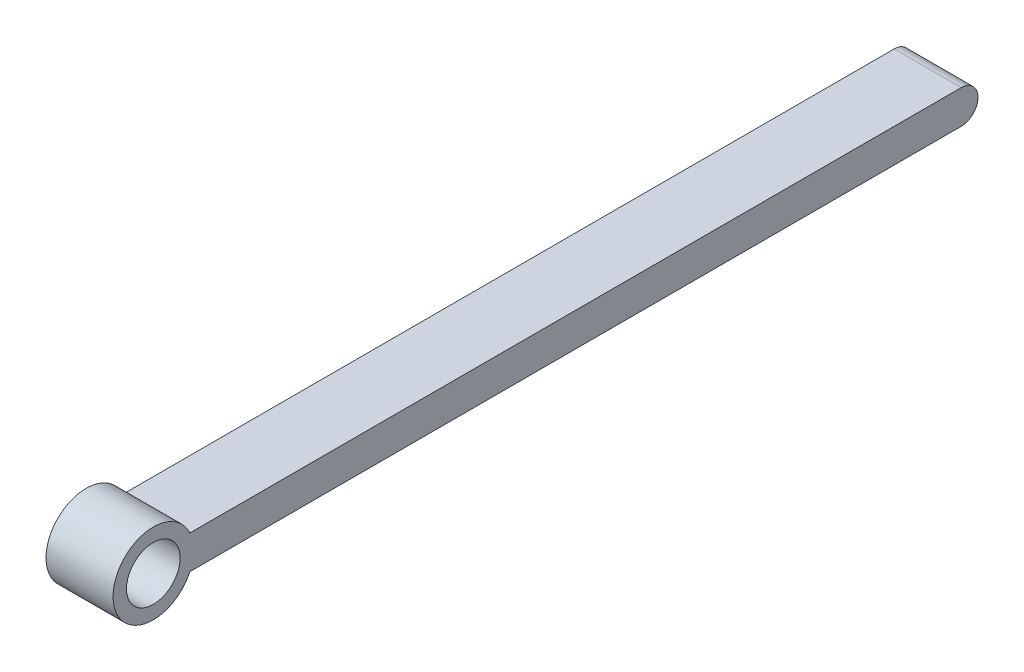
ISO-10303-21;
HEADER;
FILE_DESCRIPTION(('STEP AP214'),'2;1');
FILE_NAME('part.step','',(''),(''),'','','');
FILE_SCHEMA(('AUTOMOTIVE_DESIGN { 1 0 10303 214 1 1 1 1 }'));
ENDSEC;
DATA;
#1=APPLICATION_CONTEXT('core data for automotive mechanical design processes');
#2=APPLICATION_PROTOCOL_DEFINITION('international standard','automotive_design',2000,#1);
#3=PRODUCT_CONTEXT('',#1,'mechanical');
#4=PRODUCT('Part','Part','',(#3));
#5=PRODUCT_RELATED_PRODUCT_CATEGORY('part','',(#4));
#6=PRODUCT_DEFINITION_FORMATION('','',#4);
#7=PRODUCT_DEFINITION_CONTEXT('part definition',#1,'design');
#8=PRODUCT_DEFINITION('design','',#6,#7);
#9=PRODUCT_DEFINITION_SHAPE('','',#8);
#10=(LENGTH_UNIT() NAMED_UNIT(*) SI_UNIT(.MILLI.,.METRE.));
#11=(NAMED_UNIT(*) PLANE_ANGLE_UNIT() SI_UNIT($,.RADIAN.));
#12=(NAMED_UNIT(*) SI_UNIT($,.STERADIAN.) SOLID_ANGLE_UNIT());
#13=UNCERTAINTY_MEASURE_WITH_UNIT(LENGTH_MEASURE(1.E-05),#10,'distance_accuracy_value','');
#14=(GEOMETRIC_REPRESENTATION_CONTEXT(3) GLOBAL_UNCERTAINTY_ASSIGNED_CONTEXT((#13)) GLOBAL_UNIT_ASSIGNED_CONTEXT((#10,
#11,#12)) REPRESENTATION_CONTEXT('',''));
#15=CARTESIAN_POINT('',(0.,0.,0.));
#16=DIRECTION('',(0.,0.,1.));
#17=DIRECTION('',(1.,0.,0.));
#18=AXIS2_PLACEMENT_3D('',#15,#16,#17);
#19=CARTESIAN_POINT('',(10.,18.1245417068373,-19.5728478067927));
#20=DIRECTION('',(-1.,0.,0.));
#21=DIRECTION('',(0.,0.,1.));
#22=AXIS2_PLACEMENT_3D('',#19,#20,#21);
#23=CYLINDRICAL_SURFACE('',#22,5.99999999999999);
#24=CARTESIAN_POINT('',(0.,18.1245417068373,-19.5728478067927));
#25=DIRECTION('',(1.,0.,0.));
#26=DIRECTION('',(0.,0.,-1.));
#27=AXIS2_PLACEMENT_3D('',#24,#25,#26);
#28=CIRCLE('',#27,5.99999999999999);
#29=CARTESIAN_POINT('',(0.,20.6245417068374,-25.0272038641105));
#30=VERTEX_POINT('',#29);
#31=CARTESIAN_POINT('',(0.,15.6245417068374,-25.0272038641106));
#32=VERTEX_POINT('',#31);
#33=EDGE_CURVE('E100',#30,#32,#28,.T.);
#34=ORIENTED_EDGE('',*,*,#33,.T.);
#35=DIRECTION('',(-1.,0.,0.));
#36=VECTOR('',#35,1.);
#37=CARTESIAN_POINT('',(10.,15.6245417068374,-25.0272038641106));
#38=LINE('',#37,#36);
#39=CARTESIAN_POINT('',(10.,15.6245417068374,-25.0272038641106));
#40=VERTEX_POINT('',#39);
#41=EDGE_CURVE('E11',#40,#32,#38,.T.);
#42=ORIENTED_EDGE('',*,*,#41,.F.);
#43=CARTESIAN_POINT('',(10.,18.1245417068373,-19.5728478067927));
#44=DIRECTION('',(1.,0.,0.));
#45=DIRECTION('',(0.,0.,-1.));
#46=AXIS2_PLACEMENT_3D('',#43,#44,#45);
#47=CIRCLE('',#46,5.99999999999999);
#48=CARTESIAN_POINT('',(10.,20.6245417068374,-25.0272038641105));
#49=VERTEX_POINT('',#48);
#50=EDGE_CURVE('E83',#49,#40,#47,.T.);
#51=ORIENTED_EDGE('',*,*,#50,.F.);
#52=DIRECTION('',(-1.,0.,0.));
#53=VECTOR('',#52,1.);
#54=CARTESIAN_POINT('',(10.,20.6245417068374,-25.0272038641105));
#55=LINE('',#54,#53);
#56=EDGE_CURVE('E49',#49,#30,#55,.T.);
#57=ORIENTED_EDGE('',*,*,#56,.T.);
#58=EDGE_LOOP('',(#34,#42,#51,#57));
#59=FACE_BOUND('',#58,.T.);
#60=ADVANCED_FACE('F33',(#59),#23,.T.);
#61=CARTESIAN_POINT('',(10.,15.6245417068374,0.));
#62=DIRECTION('',(0.,1.,0.));
#63=DIRECTION('',(0.,0.,1.));
#64=AXIS2_PLACEMENT_3D('',#61,#62,#63);
#65=PLANE('',#64);
#66=DIRECTION('',(0.,0.,-1.));
#67=VECTOR('',#66,1.);
#68=CARTESIAN_POINT('',(0.,15.6245417068374,0.));
#69=LINE('',#68,#67);
#70=CARTESIAN_POINT('',(0.,15.6245417068374,-140.072847806793));
#71=VERTEX_POINT('',#70);
#72=EDGE_CURVE('E88',#32,#71,#69,.T.);
#73=ORIENTED_EDGE('',*,*,#72,.T.);
#74=DIRECTION('',(-1.,0.,0.));
#75=VECTOR('',#74,1.);
#76=CARTESIAN_POINT('',(10.,15.6245417068374,-140.072847806793));
#77=LINE('',#76,#75);
#78=CARTESIAN_POINT('',(10.,15.6245417068374,-140.072847806793));
#79=VERTEX_POINT('',#78);
#80=EDGE_CURVE('E41',#79,#71,#77,.T.);
#81=ORIENTED_EDGE('',*,*,#80,.F.);
#82=DIRECTION('',(0.,0.,-1.));
#83=VECTOR('',#82,1.);
#84=CARTESIAN_POINT('',(10.,15.6245417068374,0.));
#85=LINE('',#84,#83);
#86=EDGE_CURVE('E74',#40,#79,#85,.T.);
#87=ORIENTED_EDGE('',*,*,#86,.F.);
#88=ORIENTED_EDGE('',*,*,#41,.T.);
#89=EDGE_LOOP('',(#73,#81,#87,#88));
#90=FACE_BOUND('',#89,.T.);
#91=ADVANCED_FACE('F87',(#90),#65,.F.);
#92=CARTESIAN_POINT('',(10.,18.1245417068374,-140.072847806793));
#93=DIRECTION('',(-1.,0.,0.));
#94=DIRECTION('',(0.,0.,1.));
#95=AXIS2_PLACEMENT_3D('',#92,#93,#94);
#96=CYLINDRICAL_SURFACE('',#95,2.50000000000002);
#97=CARTESIAN_POINT('',(0.,18.1245417068374,-140.072847806793));
#98=DIRECTION('',(1.,0.,0.));
#99=DIRECTION('',(0.,0.,-1.));
#100=AXIS2_PLACEMENT_3D('',#97,#98,#99);
#101=CIRCLE('',#100,2.50000000000002);
#102=CARTESIAN_POINT('',(0.,20.6245417068374,-140.072847806793));
#103=VERTEX_POINT('',#102);
#104=EDGE_CURVE('E103',#103,#71,#101,.F.);
#105=ORIENTED_EDGE('',*,*,#104,.F.);
#106=DIRECTION('',(-1.,0.,0.));
#107=VECTOR('',#106,1.);
#108=CARTESIAN_POINT('',(10.,20.6245417068374,-140.072847806793));
#109=LINE('',#108,#107);
#110=CARTESIAN_POINT('',(10.,20.6245417068374,-140.072847806793));
#111=VERTEX_POINT('',#110);
#112=EDGE_CURVE('E63',#111,#103,#109,.T.);
#113=ORIENTED_EDGE('',*,*,#112,.F.);
#114=CARTESIAN_POINT('',(10.,18.1245417068374,-140.072847806793));
#115=DIRECTION('',(1.,0.,0.));
#116=DIRECTION('',(0.,0.,-1.));
#117=AXIS2_PLACEMENT_3D('',#114,#115,#116);
#118=CIRCLE('',#117,2.50000000000002);
#119=EDGE_CURVE('E82',#111,#79,#118,.F.);
#120=ORIENTED_EDGE('',*,*,#119,.T.);
#121=ORIENTED_EDGE('',*,*,#80,.T.);
#122=EDGE_LOOP('',(#105,#113,#120,#121));
#123=FACE_BOUND('',#122,.T.);
#124=ADVANCED_FACE('F91',(#123),#96,.T.);
#125=CARTESIAN_POINT('',(10.,20.6245417068374,0.));
#126=DIRECTION('',(0.,1.,0.));
#127=DIRECTION('',(0.,0.,1.));
#128=AXIS2_PLACEMENT_3D('',#125,#126,#127);
#129=PLANE('',#128);
#130=DIRECTION('',(0.,0.,-1.));
#131=VECTOR('',#130,1.);
#132=CARTESIAN_POINT('',(0.,20.6245417068374,0.));
#133=LINE('',#132,#131);
#134=EDGE_CURVE('E105',#30,#103,#133,.T.);
#135=ORIENTED_EDGE('',*,*,#134,.F.);
#136=ORIENTED_EDGE('',*,*,#56,.F.);
#137=DIRECTION('',(0.,0.,-1.));
#138=VECTOR('',#137,1.);
#139=CARTESIAN_POINT('',(10.,20.6245417068374,0.));
#140=LINE('',#139,#138);
#141=EDGE_CURVE('E92',#49,#111,#140,.T.);
#142=ORIENTED_EDGE('',*,*,#141,.T.);
#143=ORIENTED_EDGE('',*,*,#112,.T.);
#144=EDGE_LOOP('',(#135,#136,#142,#143));
#145=FACE_BOUND('',#144,.T.);
#146=ADVANCED_FACE('F118',(#145),#129,.T.);
#147=CARTESIAN_POINT('',(10.,18.1245417068373,-19.5728478067927));
#148=DIRECTION('',(-1.,0.,0.));
#149=DIRECTION('',(0.,0.,1.));
#150=AXIS2_PLACEMENT_3D('',#147,#148,#149);
#151=CYLINDRICAL_SURFACE('',#150,3.99999999999999);
#152=CARTESIAN_POINT('',(10.,18.1245417068373,-19.5728478067927));
#153=DIRECTION('',(1.,0.,0.));
#154=DIRECTION('',(0.,0.,-1.));
#155=AXIS2_PLACEMENT_3D('',#152,#153,#154);
#156=CIRCLE('',#155,3.99999999999999);
#157=CARTESIAN_POINT('',(10.,18.1245417068373,-23.5728478067927));
#158=VERTEX_POINT('',#157);
#159=EDGE_CURVE('E94',#158,#158,#156,.T.);
#160=ORIENTED_EDGE('',*,*,#159,.T.);
#161=EDGE_LOOP('',(#160));
#162=FACE_BOUND('',#161,.T.);
#163=CARTESIAN_POINT('',(0.,18.1245417068373,-19.5728478067927));
#164=DIRECTION('',(1.,0.,0.));
#165=DIRECTION('',(0.,0.,-1.));
#166=AXIS2_PLACEMENT_3D('',#163,#164,#165);
#167=CIRCLE('',#166,3.99999999999999);
#168=CARTESIAN_POINT('',(0.,18.1245417068373,-23.5728478067927));
#169=VERTEX_POINT('',#168);
#170=EDGE_CURVE('E108',#169,#169,#167,.T.);
#171=ORIENTED_EDGE('',*,*,#170,.F.);
#172=EDGE_LOOP('',(#171));
#173=FACE_BOUND('',#172,.T.);
#174=ADVANCED_FACE('F116',(#162,#173),#151,.F.);
#175=CARTESIAN_POINT('',(10.,0.,0.));
#176=DIRECTION('',(1.,0.,0.));
#177=DIRECTION('',(0.,0.,-1.));
#178=AXIS2_PLACEMENT_3D('',#175,#176,#177);
#179=PLANE('',#178);
#180=ORIENTED_EDGE('',*,*,#50,.T.);
#181=ORIENTED_EDGE('',*,*,#86,.T.);
#182=ORIENTED_EDGE('',*,*,#119,.F.);
#183=ORIENTED_EDGE('',*,*,#141,.F.);
#184=EDGE_LOOP('',(#180,#181,#182,#183));
#185=FACE_BOUND('',#184,.T.);
#186=ORIENTED_EDGE('',*,*,#159,.F.);
#187=EDGE_LOOP('',(#186));
#188=FACE_BOUND('',#187,.T.);
#189=ADVANCED_FACE('F78',(#185,#188),#179,.T.);
#190=CARTESIAN_POINT('',(0.,0.,0.));
#191=DIRECTION('',(1.,0.,0.));
#192=DIRECTION('',(0.,0.,-1.));
#193=AXIS2_PLACEMENT_3D('',#190,#191,#192);
#194=PLANE('',#193);
#195=ORIENTED_EDGE('',*,*,#33,.F.);
#196=ORIENTED_EDGE('',*,*,#134,.T.);
#197=ORIENTED_EDGE('',*,*,#104,.T.);
#198=ORIENTED_EDGE('',*,*,#72,.F.);
#199=EDGE_LOOP('',(#195,#196,#197,#198));
#200=FACE_BOUND('',#199,.T.);
#201=ORIENTED_EDGE('',*,*,#170,.T.);
#202=EDGE_LOOP('',(#201));
#203=FACE_BOUND('',#202,.T.);
#204=ADVANCED_FACE('F114',(#200,#203),#194,.F.);
#205=CLOSED_SHELL('',(#60,#91,#124,#146,#174,#189,#204));
#206=MANIFOLD_SOLID_BREP('B2',#205);
#207=ADVANCED_BREP_SHAPE_REPRESENTATION('',(#18,#206),#14);
#208=SHAPE_DEFINITION_REPRESENTATION(#9,#207);
ENDSEC;
END-ISO-10303-21;
